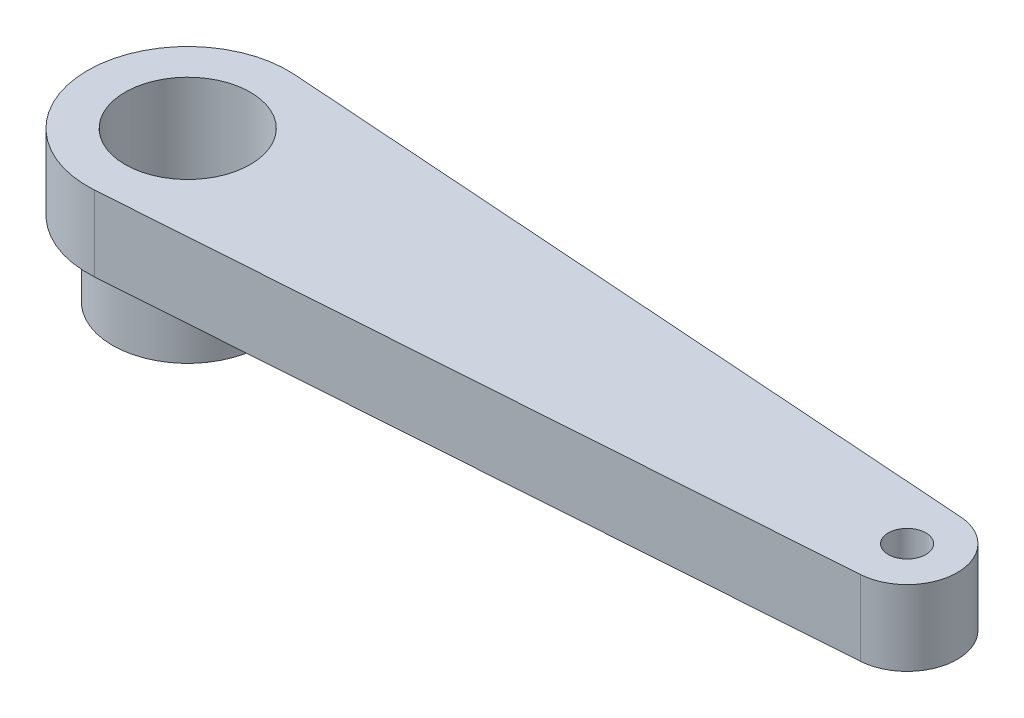
ISO-10303-21;
HEADER;
FILE_DESCRIPTION(('STEP AP214'),'2;1');
FILE_NAME('part.step','',(''),(''),'','','');
FILE_SCHEMA(('AUTOMOTIVE_DESIGN { 1 0 10303 214 1 1 1 1 }'));
ENDSEC;
DATA;
#1=APPLICATION_CONTEXT('core data for automotive mechanical design processes');
#2=APPLICATION_PROTOCOL_DEFINITION('international standard','automotive_design',2000,#1);
#3=PRODUCT_CONTEXT('',#1,'mechanical');
#4=PRODUCT('Part','Part','',(#3));
#5=PRODUCT_RELATED_PRODUCT_CATEGORY('part','',(#4));
#6=PRODUCT_DEFINITION_FORMATION('','',#4);
#7=PRODUCT_DEFINITION_CONTEXT('part definition',#1,'design');
#8=PRODUCT_DEFINITION('design','',#6,#7);
#9=PRODUCT_DEFINITION_SHAPE('','',#8);
#10=(LENGTH_UNIT() NAMED_UNIT(*) SI_UNIT(.MILLI.,.METRE.));
#11=(NAMED_UNIT(*) PLANE_ANGLE_UNIT() SI_UNIT($,.RADIAN.));
#12=(NAMED_UNIT(*) SI_UNIT($,.STERADIAN.) SOLID_ANGLE_UNIT());
#13=UNCERTAINTY_MEASURE_WITH_UNIT(LENGTH_MEASURE(1.E-05),#10,'distance_accuracy_value','');
#14=(GEOMETRIC_REPRESENTATION_CONTEXT(3) GLOBAL_UNCERTAINTY_ASSIGNED_CONTEXT((#13)) GLOBAL_UNIT_ASSIGNED_CONTEXT((#10,
#11,#12)) REPRESENTATION_CONTEXT('',''));
#15=CARTESIAN_POINT('',(0.,0.,0.));
#16=DIRECTION('',(0.,0.,1.));
#17=DIRECTION('',(1.,0.,0.));
#18=AXIS2_PLACEMENT_3D('',#15,#16,#17);
#19=CARTESIAN_POINT('',(0.,3.,0.));
#20=DIRECTION('',(0.,1.,0.));
#21=DIRECTION('',(0.,0.,1.));
#22=AXIS2_PLACEMENT_3D('',#19,#20,#21);
#23=PLANE('',#22);
#24=CARTESIAN_POINT('',(0.,3.,0.));
#25=DIRECTION('',(0.,1.,0.));
#26=DIRECTION('',(0.,0.,1.));
#27=AXIS2_PLACEMENT_3D('',#24,#25,#26);
#28=CIRCLE('',#27,2.5);
#29=CARTESIAN_POINT('',(0.,3.,2.5));
#30=VERTEX_POINT('',#29);
#31=EDGE_CURVE('E112',#30,#30,#28,.T.);
#32=ORIENTED_EDGE('',*,*,#31,.F.);
#33=EDGE_LOOP('',(#32));
#34=FACE_BOUND('',#33,.T.);
#35=CARTESIAN_POINT('',(0.,3.,0.));
#36=DIRECTION('',(0.,1.,0.));
#37=DIRECTION('',(0.,0.,1.));
#38=AXIS2_PLACEMENT_3D('',#35,#36,#37);
#39=CIRCLE('',#38,4.);
#40=CARTESIAN_POINT('',(0.278745644599303,3.,-3.99027578816514));
#41=VERTEX_POINT('',#40);
#42=CARTESIAN_POINT('',(0.278745644599303,3.,3.99027578816514));
#43=VERTEX_POINT('',#42);
#44=EDGE_CURVE('E97',#41,#43,#39,.T.);
#45=ORIENTED_EDGE('',*,*,#44,.T.);
#46=DIRECTION('',(0.997568947041285,0.,-0.0696864111498258));
#47=VECTOR('',#46,1.);
#48=CARTESIAN_POINT('',(0.278745644599303,3.,3.99027578816514));
#49=LINE('',#48,#47);
#50=CARTESIAN_POINT('',(28.8393728222997,3.,1.99513789408257));
#51=VERTEX_POINT('',#50);
#52=EDGE_CURVE('E92',#43,#51,#49,.T.);
#53=ORIENTED_EDGE('',*,*,#52,.T.);
#54=CARTESIAN_POINT('',(28.7,3.,0.));
#55=DIRECTION('',(0.,1.,0.));
#56=DIRECTION('',(0.,0.,1.));
#57=AXIS2_PLACEMENT_3D('',#54,#55,#56);
#58=CIRCLE('',#57,2.);
#59=CARTESIAN_POINT('',(28.8393728222997,3.,-1.99513789408257));
#60=VERTEX_POINT('',#59);
#61=EDGE_CURVE('E95',#51,#60,#58,.T.);
#62=ORIENTED_EDGE('',*,*,#61,.T.);
#63=DIRECTION('',(-0.997568947041285,0.,-0.0696864111498258));
#64=VECTOR('',#63,1.);
#65=CARTESIAN_POINT('',(0.278745644599303,3.,-3.99027578816514));
#66=LINE('',#65,#64);
#67=EDGE_CURVE('E62',#60,#41,#66,.T.);
#68=ORIENTED_EDGE('',*,*,#67,.T.);
#69=EDGE_LOOP('',(#45,#53,#62,#68));
#70=FACE_BOUND('',#69,.T.);
#71=CARTESIAN_POINT('',(28.7,3.,0.));
#72=DIRECTION('',(0.,1.,0.));
#73=DIRECTION('',(0.,0.,1.));
#74=AXIS2_PLACEMENT_3D('',#71,#72,#73);
#75=CIRCLE('',#74,0.750000000000002);
#76=CARTESIAN_POINT('',(28.7,3.,0.750000000000002));
#77=VERTEX_POINT('',#76);
#78=EDGE_CURVE('E126',#77,#77,#75,.T.);
#79=ORIENTED_EDGE('',*,*,#78,.F.);
#80=EDGE_LOOP('',(#79));
#81=FACE_BOUND('',#80,.T.);
#82=ADVANCED_FACE('F45',(#34,#70,#81),#23,.T.);
#83=CARTESIAN_POINT('',(0.,0.,0.));
#84=DIRECTION('',(0.,1.,0.));
#85=DIRECTION('',(0.,0.,1.));
#86=AXIS2_PLACEMENT_3D('',#83,#84,#85);
#87=PLANE('',#86);
#88=CARTESIAN_POINT('',(0.,0.,0.));
#89=DIRECTION('',(0.,1.,0.));
#90=DIRECTION('',(0.,0.,1.));
#91=AXIS2_PLACEMENT_3D('',#88,#89,#90);
#92=CIRCLE('',#91,3.);
#93=CARTESIAN_POINT('',(0.,0.,3.));
#94=VERTEX_POINT('',#93);
#95=EDGE_CURVE('E133',#94,#94,#92,.T.);
#96=ORIENTED_EDGE('',*,*,#95,.T.);
#97=EDGE_LOOP('',(#96));
#98=FACE_BOUND('',#97,.T.);
#99=CARTESIAN_POINT('',(0.,0.,0.));
#100=DIRECTION('',(0.,1.,0.));
#101=DIRECTION('',(0.,0.,1.));
#102=AXIS2_PLACEMENT_3D('',#99,#100,#101);
#103=CIRCLE('',#102,4.);
#104=CARTESIAN_POINT('',(0.278745644599303,0.,-3.99027578816514));
#105=VERTEX_POINT('',#104);
#106=CARTESIAN_POINT('',(0.278745644599303,0.,3.99027578816514));
#107=VERTEX_POINT('',#106);
#108=EDGE_CURVE('E109',#105,#107,#103,.T.);
#109=ORIENTED_EDGE('',*,*,#108,.F.);
#110=DIRECTION('',(-0.997568947041285,0.,-0.0696864111498258));
#111=VECTOR('',#110,1.);
#112=CARTESIAN_POINT('',(0.278745644599303,0.,-3.99027578816514));
#113=LINE('',#112,#111);
#114=CARTESIAN_POINT('',(28.8393728222997,0.,-1.99513789408257));
#115=VERTEX_POINT('',#114);
#116=EDGE_CURVE('E85',#115,#105,#113,.T.);
#117=ORIENTED_EDGE('',*,*,#116,.F.);
#118=CARTESIAN_POINT('',(28.7,0.,0.));
#119=DIRECTION('',(0.,1.,0.));
#120=DIRECTION('',(0.,0.,1.));
#121=AXIS2_PLACEMENT_3D('',#118,#119,#120);
#122=CIRCLE('',#121,2.);
#123=CARTESIAN_POINT('',(28.8393728222997,0.,1.99513789408257));
#124=VERTEX_POINT('',#123);
#125=EDGE_CURVE('E79',#124,#115,#122,.T.);
#126=ORIENTED_EDGE('',*,*,#125,.F.);
#127=DIRECTION('',(0.997568947041285,0.,-0.0696864111498258));
#128=VECTOR('',#127,1.);
#129=CARTESIAN_POINT('',(0.278745644599303,0.,3.99027578816514));
#130=LINE('',#129,#128);
#131=EDGE_CURVE('E101',#107,#124,#130,.T.);
#132=ORIENTED_EDGE('',*,*,#131,.F.);
#133=EDGE_LOOP('',(#109,#117,#126,#132));
#134=FACE_BOUND('',#133,.T.);
#135=CARTESIAN_POINT('',(28.7,0.,0.));
#136=DIRECTION('',(0.,1.,0.));
#137=DIRECTION('',(0.,0.,1.));
#138=AXIS2_PLACEMENT_3D('',#135,#136,#137);
#139=CIRCLE('',#138,0.750000000000002);
#140=CARTESIAN_POINT('',(28.7,0.,0.750000000000002));
#141=VERTEX_POINT('',#140);
#142=EDGE_CURVE('E127',#141,#141,#139,.T.);
#143=ORIENTED_EDGE('',*,*,#142,.T.);
#144=EDGE_LOOP('',(#143));
#145=FACE_BOUND('',#144,.T.);
#146=ADVANCED_FACE('F120',(#98,#134,#145),#87,.F.);
#147=CARTESIAN_POINT('',(0.,3.,0.));
#148=DIRECTION('',(0.,-1.,0.));
#149=DIRECTION('',(0.,0.,-1.));
#150=AXIS2_PLACEMENT_3D('',#147,#148,#149);
#151=CYLINDRICAL_SURFACE('',#150,4.);
#152=ORIENTED_EDGE('',*,*,#108,.T.);
#153=DIRECTION('',(0.,-1.,0.));
#154=VECTOR('',#153,1.);
#155=CARTESIAN_POINT('',(0.278745644599303,3.,3.99027578816514));
#156=LINE('',#155,#154);
#157=EDGE_CURVE('E11',#43,#107,#156,.T.);
#158=ORIENTED_EDGE('',*,*,#157,.F.);
#159=ORIENTED_EDGE('',*,*,#44,.F.);
#160=DIRECTION('',(0.,-1.,0.));
#161=VECTOR('',#160,1.);
#162=CARTESIAN_POINT('',(0.278745644599303,3.,-3.99027578816514));
#163=LINE('',#162,#161);
#164=EDGE_CURVE('E105',#41,#105,#163,.T.);
#165=ORIENTED_EDGE('',*,*,#164,.T.);
#166=EDGE_LOOP('',(#152,#158,#159,#165));
#167=FACE_BOUND('',#166,.T.);
#168=ADVANCED_FACE('F47',(#167),#151,.T.);
#169=CARTESIAN_POINT('',(0.278745644599303,3.,3.99027578816514));
#170=DIRECTION('',(-0.0696864111498258,0.,-0.997568947041285));
#171=DIRECTION('',(-0.997568947041285,0.,0.0696864111498258));
#172=AXIS2_PLACEMENT_3D('',#169,#170,#171);
#173=PLANE('',#172);
#174=ORIENTED_EDGE('',*,*,#131,.T.);
#175=DIRECTION('',(0.,-1.,0.));
#176=VECTOR('',#175,1.);
#177=CARTESIAN_POINT('',(28.8393728222997,3.,1.99513789408257));
#178=LINE('',#177,#176);
#179=EDGE_CURVE('E54',#51,#124,#178,.T.);
#180=ORIENTED_EDGE('',*,*,#179,.F.);
#181=ORIENTED_EDGE('',*,*,#52,.F.);
#182=ORIENTED_EDGE('',*,*,#157,.T.);
#183=EDGE_LOOP('',(#174,#180,#181,#182));
#184=FACE_BOUND('',#183,.T.);
#185=ADVANCED_FACE('F100',(#184),#173,.F.);
#186=CARTESIAN_POINT('',(28.7,3.,0.));
#187=DIRECTION('',(0.,-1.,0.));
#188=DIRECTION('',(0.,0.,-1.));
#189=AXIS2_PLACEMENT_3D('',#186,#187,#188);
#190=CYLINDRICAL_SURFACE('',#189,2.);
#191=ORIENTED_EDGE('',*,*,#125,.T.);
#192=DIRECTION('',(0.,-1.,0.));
#193=VECTOR('',#192,1.);
#194=CARTESIAN_POINT('',(28.8393728222997,3.,-1.99513789408257));
#195=LINE('',#194,#193);
#196=EDGE_CURVE('E102',#60,#115,#195,.T.);
#197=ORIENTED_EDGE('',*,*,#196,.F.);
#198=ORIENTED_EDGE('',*,*,#61,.F.);
#199=ORIENTED_EDGE('',*,*,#179,.T.);
#200=EDGE_LOOP('',(#191,#197,#198,#199));
#201=FACE_BOUND('',#200,.T.);
#202=ADVANCED_FACE('F103',(#201),#190,.T.);
#203=CARTESIAN_POINT('',(0.278745644599303,3.,-3.99027578816514));
#204=DIRECTION('',(-0.0696864111498258,0.,0.997568947041285));
#205=DIRECTION('',(0.997568947041285,0.,0.0696864111498258));
#206=AXIS2_PLACEMENT_3D('',#203,#204,#205);
#207=PLANE('',#206);
#208=ORIENTED_EDGE('',*,*,#116,.T.);
#209=ORIENTED_EDGE('',*,*,#164,.F.);
#210=ORIENTED_EDGE('',*,*,#67,.F.);
#211=ORIENTED_EDGE('',*,*,#196,.T.);
#212=EDGE_LOOP('',(#208,#209,#210,#211));
#213=FACE_BOUND('',#212,.T.);
#214=ADVANCED_FACE('F117',(#213),#207,.F.);
#215=CARTESIAN_POINT('',(0.,3.,0.));
#216=DIRECTION('',(0.,-1.,0.));
#217=DIRECTION('',(0.,0.,-1.));
#218=AXIS2_PLACEMENT_3D('',#215,#216,#217);
#219=CYLINDRICAL_SURFACE('',#218,2.5);
#220=ORIENTED_EDGE('',*,*,#31,.T.);
#221=EDGE_LOOP('',(#220));
#222=FACE_BOUND('',#221,.T.);
#223=CARTESIAN_POINT('',(0.,-3.,0.));
#224=DIRECTION('',(0.,1.,0.));
#225=DIRECTION('',(0.,0.,1.));
#226=AXIS2_PLACEMENT_3D('',#223,#224,#225);
#227=CIRCLE('',#226,2.5);
#228=CARTESIAN_POINT('',(0.,-3.,2.5));
#229=VERTEX_POINT('',#228);
#230=EDGE_CURVE('E136',#229,#229,#227,.T.);
#231=ORIENTED_EDGE('',*,*,#230,.F.);
#232=EDGE_LOOP('',(#231));
#233=FACE_BOUND('',#232,.T.);
#234=ADVANCED_FACE('F145',(#222,#233),#219,.F.);
#235=CARTESIAN_POINT('',(28.7,3.,0.));
#236=DIRECTION('',(0.,-1.,0.));
#237=DIRECTION('',(0.,0.,-1.));
#238=AXIS2_PLACEMENT_3D('',#235,#236,#237);
#239=CYLINDRICAL_SURFACE('',#238,0.750000000000002);
#240=ORIENTED_EDGE('',*,*,#78,.T.);
#241=EDGE_LOOP('',(#240));
#242=FACE_BOUND('',#241,.T.);
#243=ORIENTED_EDGE('',*,*,#142,.F.);
#244=EDGE_LOOP('',(#243));
#245=FACE_BOUND('',#244,.T.);
#246=ADVANCED_FACE('F147',(#242,#245),#239,.F.);
#247=CARTESIAN_POINT('',(0.,-3.,0.));
#248=DIRECTION('',(0.,1.,0.));
#249=DIRECTION('',(0.,0.,1.));
#250=AXIS2_PLACEMENT_3D('',#247,#248,#249);
#251=CYLINDRICAL_SURFACE('',#250,3.);
#252=CARTESIAN_POINT('',(0.,-3.,0.));
#253=DIRECTION('',(0.,1.,0.));
#254=DIRECTION('',(0.,0.,1.));
#255=AXIS2_PLACEMENT_3D('',#252,#253,#254);
#256=CIRCLE('',#255,3.);
#257=CARTESIAN_POINT('',(0.,-3.,3.));
#258=VERTEX_POINT('',#257);
#259=EDGE_CURVE('E130',#258,#258,#256,.T.);
#260=ORIENTED_EDGE('',*,*,#259,.T.);
#261=EDGE_LOOP('',(#260));
#262=FACE_BOUND('',#261,.T.);
#263=ORIENTED_EDGE('',*,*,#95,.F.);
#264=EDGE_LOOP('',(#263));
#265=FACE_BOUND('',#264,.T.);
#266=ADVANCED_FACE('F155',(#262,#265),#251,.T.);
#267=CARTESIAN_POINT('',(0.,-3.,0.));
#268=DIRECTION('',(0.,1.,0.));
#269=DIRECTION('',(0.,0.,1.));
#270=AXIS2_PLACEMENT_3D('',#267,#268,#269);
#271=PLANE('',#270);
#272=ORIENTED_EDGE('',*,*,#230,.T.);
#273=EDGE_LOOP('',(#272));
#274=FACE_BOUND('',#273,.T.);
#275=ORIENTED_EDGE('',*,*,#259,.F.);
#276=EDGE_LOOP('',(#275));
#277=FACE_BOUND('',#276,.T.);
#278=ADVANCED_FACE('F142',(#274,#277),#271,.F.);
#279=CLOSED_SHELL('',(#82,#146,#168,#185,#202,#214,#234,#246,#266,#278));
#280=MANIFOLD_SOLID_BREP('B2',#279);
#281=ADVANCED_BREP_SHAPE_REPRESENTATION('',(#18,#280),#14);
#282=SHAPE_DEFINITION_REPRESENTATION(#9,#281);
ENDSEC;
END-ISO-10303-21;
